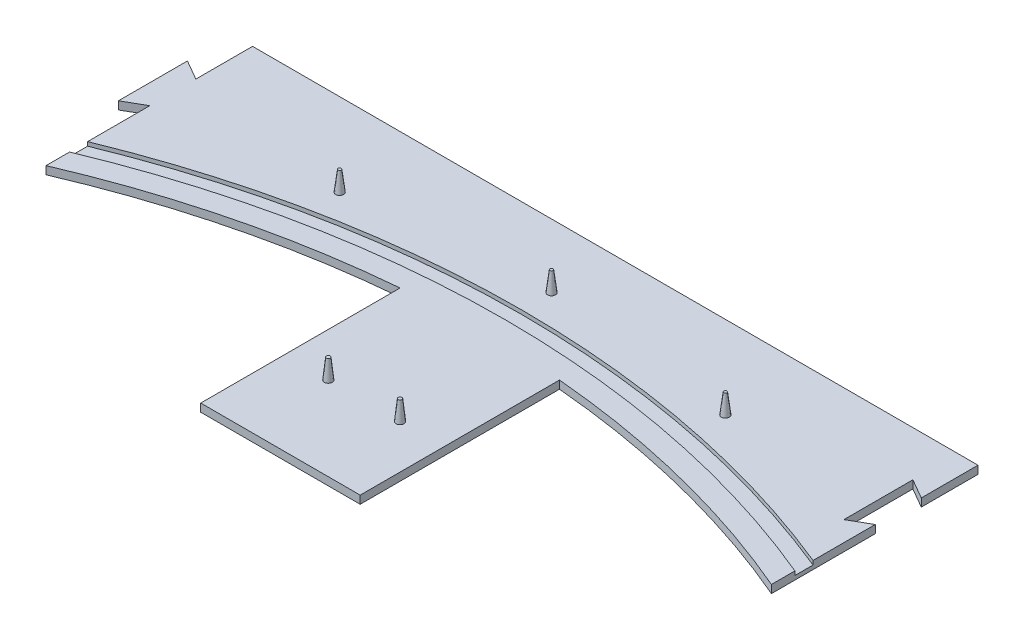
ISO-10303-21;
HEADER;
FILE_DESCRIPTION(('STEP AP214'),'2;1');
FILE_NAME('part.step','',(''),(''),'','','');
FILE_SCHEMA(('AUTOMOTIVE_DESIGN { 1 0 10303 214 1 1 1 1 }'));
ENDSEC;
DATA;
#1=APPLICATION_CONTEXT('core data for automotive mechanical design processes');
#2=APPLICATION_PROTOCOL_DEFINITION('international standard','automotive_design',2000,#1);
#3=PRODUCT_CONTEXT('',#1,'mechanical');
#4=PRODUCT('Part','Part','',(#3));
#5=PRODUCT_RELATED_PRODUCT_CATEGORY('part','',(#4));
#6=PRODUCT_DEFINITION_FORMATION('','',#4);
#7=PRODUCT_DEFINITION_CONTEXT('part definition',#1,'design');
#8=PRODUCT_DEFINITION('design','',#6,#7);
#9=PRODUCT_DEFINITION_SHAPE('','',#8);
#10=(LENGTH_UNIT() NAMED_UNIT(*) SI_UNIT(.MILLI.,.METRE.));
#11=(NAMED_UNIT(*) PLANE_ANGLE_UNIT() SI_UNIT($,.RADIAN.));
#12=(NAMED_UNIT(*) SI_UNIT($,.STERADIAN.) SOLID_ANGLE_UNIT());
#13=UNCERTAINTY_MEASURE_WITH_UNIT(LENGTH_MEASURE(1.E-05),#10,'distance_accuracy_value','');
#14=(GEOMETRIC_REPRESENTATION_CONTEXT(3) GLOBAL_UNCERTAINTY_ASSIGNED_CONTEXT((#13)) GLOBAL_UNIT_ASSIGNED_CONTEXT((#10,
#11,#12)) REPRESENTATION_CONTEXT('',''));
#15=CARTESIAN_POINT('',(0.,0.,0.));
#16=DIRECTION('',(0.,0.,1.));
#17=DIRECTION('',(1.,0.,0.));
#18=AXIS2_PLACEMENT_3D('',#15,#16,#17);
#19=CARTESIAN_POINT('',(0.,0.,0.));
#20=DIRECTION('',(0.,1.,0.));
#21=DIRECTION('',(0.,0.,1.));
#22=AXIS2_PLACEMENT_3D('',#19,#20,#21);
#23=PLANE('',#22);
#24=CARTESIAN_POINT('',(-9.,0.,-201.));
#25=DIRECTION('',(0.,1.,0.));
#26=DIRECTION('',(0.,0.,1.));
#27=AXIS2_PLACEMENT_3D('',#24,#25,#26);
#28=CIRCLE('',#27,1.);
#29=CARTESIAN_POINT('',(-9.,0.,-200.));
#30=VERTEX_POINT('',#29);
#31=EDGE_CURVE('E334',#30,#30,#28,.T.);
#32=ORIENTED_EDGE('',*,*,#31,.F.);
#33=EDGE_LOOP('',(#32));
#34=FACE_BOUND('',#33,.T.);
#35=CARTESIAN_POINT('',(9.,0.,-201.));
#36=DIRECTION('',(0.,1.,0.));
#37=DIRECTION('',(0.,0.,1.));
#38=AXIS2_PLACEMENT_3D('',#35,#36,#37);
#39=CIRCLE('',#38,1.);
#40=CARTESIAN_POINT('',(9.,0.,-200.));
#41=VERTEX_POINT('',#40);
#42=EDGE_CURVE('E344',#41,#41,#39,.T.);
#43=ORIENTED_EDGE('',*,*,#42,.F.);
#44=EDGE_LOOP('',(#43));
#45=FACE_BOUND('',#44,.T.);
#46=DIRECTION('',(0.,0.,-1.));
#47=VECTOR('',#46,1.);
#48=CARTESIAN_POINT('',(90.9999999999999,0.,0.));
#49=LINE('',#48,#47);
#50=CARTESIAN_POINT('',(91.,0.,-212.176813059297));
#51=VERTEX_POINT('',#50);
#52=CARTESIAN_POINT('',(91.,0.,-218.074964175166));
#53=VERTEX_POINT('',#52);
#54=EDGE_CURVE('E280',#51,#53,#49,.T.);
#55=ORIENTED_EDGE('',*,*,#54,.T.);
#56=CARTESIAN_POINT('',(0.,0.,0.));
#57=DIRECTION('',(0.,1.,0.));
#58=DIRECTION('',(0.,0.,1.));
#59=AXIS2_PLACEMENT_3D('',#56,#57,#58);
#60=CIRCLE('',#59,236.3);
#61=CARTESIAN_POINT('',(-91.,0.,-218.074964175166));
#62=VERTEX_POINT('',#61);
#63=EDGE_CURVE('E176',#53,#62,#60,.T.);
#64=ORIENTED_EDGE('',*,*,#63,.T.);
#65=DIRECTION('',(0.,0.,1.));
#66=VECTOR('',#65,1.);
#67=CARTESIAN_POINT('',(-91.0000000000001,0.,0.));
#68=LINE('',#67,#66);
#69=CARTESIAN_POINT('',(-91.,0.,-212.176813059297));
#70=VERTEX_POINT('',#69);
#71=EDGE_CURVE('E269',#62,#70,#68,.T.);
#72=ORIENTED_EDGE('',*,*,#71,.T.);
#73=CARTESIAN_POINT('',(0.,0.,0.));
#74=DIRECTION('',(0.,1.,0.));
#75=DIRECTION('',(0.,0.,-1.));
#76=AXIS2_PLACEMENT_3D('',#73,#74,#75);
#77=CIRCLE('',#76,230.867927612304);
#78=CARTESIAN_POINT('',(-20.,0.,-230.));
#79=VERTEX_POINT('',#78);
#80=EDGE_CURVE('E293',#79,#70,#77,.T.);
#81=ORIENTED_EDGE('',*,*,#80,.F.);
#82=DIRECTION('',(0.,0.,1.));
#83=VECTOR('',#82,1.);
#84=CARTESIAN_POINT('',(-20.,0.,0.));
#85=LINE('',#84,#83);
#86=CARTESIAN_POINT('',(-20.,0.,-180.));
#87=VERTEX_POINT('',#86);
#88=EDGE_CURVE('E311',#79,#87,#85,.T.);
#89=ORIENTED_EDGE('',*,*,#88,.T.);
#90=DIRECTION('',(1.,0.,0.));
#91=VECTOR('',#90,1.);
#92=CARTESIAN_POINT('',(0.,0.,-180.));
#93=LINE('',#92,#91);
#94=CARTESIAN_POINT('',(20.,0.,-180.));
#95=VERTEX_POINT('',#94);
#96=EDGE_CURVE('E307',#87,#95,#93,.T.);
#97=ORIENTED_EDGE('',*,*,#96,.T.);
#98=DIRECTION('',(0.,0.,1.));
#99=VECTOR('',#98,1.);
#100=CARTESIAN_POINT('',(20.,0.,0.));
#101=LINE('',#100,#99);
#102=CARTESIAN_POINT('',(20.,0.,-230.));
#103=VERTEX_POINT('',#102);
#104=EDGE_CURVE('E288',#103,#95,#101,.T.);
#105=ORIENTED_EDGE('',*,*,#104,.F.);
#106=CARTESIAN_POINT('',(0.,0.,0.));
#107=DIRECTION('',(0.,1.,0.));
#108=DIRECTION('',(0.866025403784436,0.,-0.500000000000004));
#109=AXIS2_PLACEMENT_3D('',#106,#107,#108);
#110=CIRCLE('',#109,230.867927612304);
#111=EDGE_CURVE('E321',#51,#103,#110,.T.);
#112=ORIENTED_EDGE('',*,*,#111,.F.);
#113=EDGE_LOOP('',(#55,#64,#72,#81,#89,#97,#105,#112));
#114=FACE_BOUND('',#113,.T.);
#115=ADVANCED_FACE('F38',(#34,#45,#114),#23,.T.);
#116=CARTESIAN_POINT('',(91.,5.,-290.));
#117=DIRECTION('',(1.,0.,0.));
#118=DIRECTION('',(0.,0.,-1.));
#119=AXIS2_PLACEMENT_3D('',#116,#117,#118);
#120=PLANE('',#119);
#121=DIRECTION('',(0.,1.,0.));
#122=VECTOR('',#121,1.);
#123=CARTESIAN_POINT('',(90.9999999999999,-1.,-222.619069264068));
#124=LINE('',#123,#122);
#125=CARTESIAN_POINT('',(91.,-1.,-222.619069264068));
#126=VERTEX_POINT('',#125);
#127=CARTESIAN_POINT('',(91.,0.,-222.619069264068));
#128=VERTEX_POINT('',#127);
#129=EDGE_CURVE('E196',#126,#128,#124,.T.);
#130=ORIENTED_EDGE('',*,*,#129,.F.);
#131=DIRECTION('',(0.,0.,1.));
#132=VECTOR('',#131,1.);
#133=CARTESIAN_POINT('',(91.,-1.,-290.));
#134=LINE('',#133,#132);
#135=CARTESIAN_POINT('',(91.,-1.,-218.074964175166));
#136=VERTEX_POINT('',#135);
#137=EDGE_CURVE('E181',#126,#136,#134,.T.);
#138=ORIENTED_EDGE('',*,*,#137,.T.);
#139=DIRECTION('',(0.,1.,0.));
#140=VECTOR('',#139,1.);
#141=CARTESIAN_POINT('',(90.9999999999999,-1.,-218.074964175166));
#142=LINE('',#141,#140);
#143=EDGE_CURVE('E173',#136,#53,#142,.T.);
#144=ORIENTED_EDGE('',*,*,#143,.T.);
#145=ORIENTED_EDGE('',*,*,#54,.F.);
#146=DIRECTION('',(0.,1.,0.));
#147=VECTOR('',#146,1.);
#148=CARTESIAN_POINT('',(90.9999999999999,-2.,-212.176813059297));
#149=LINE('',#148,#147);
#150=CARTESIAN_POINT('',(91.,-2.,-212.176813059297));
#151=VERTEX_POINT('',#150);
#152=EDGE_CURVE('E388',#51,#151,#149,.F.);
#153=ORIENTED_EDGE('',*,*,#152,.T.);
#154=DIRECTION('',(0.,0.,1.));
#155=VECTOR('',#154,1.);
#156=CARTESIAN_POINT('',(91.,-2.,-290.));
#157=LINE('',#156,#155);
#158=CARTESIAN_POINT('',(91.,-2.,-238.226497308104));
#159=VERTEX_POINT('',#158);
#160=EDGE_CURVE('E259',#159,#151,#157,.T.);
#161=ORIENTED_EDGE('',*,*,#160,.F.);
#162=DIRECTION('',(0.,-1.,0.));
#163=VECTOR('',#162,1.);
#164=CARTESIAN_POINT('',(91.,5.,-238.226497308104));
#165=LINE('',#164,#163);
#166=CARTESIAN_POINT('',(91.,0.,-238.226497308104));
#167=VERTEX_POINT('',#166);
#168=EDGE_CURVE('E402',#167,#159,#165,.T.);
#169=ORIENTED_EDGE('',*,*,#168,.F.);
#170=EDGE_CURVE('E284',#128,#167,#49,.T.);
#171=ORIENTED_EDGE('',*,*,#170,.F.);
#172=EDGE_LOOP('',(#130,#138,#144,#145,#153,#161,#169,#171));
#173=FACE_BOUND('',#172,.T.);
#174=ADVANCED_FACE('F194',(#173),#120,.T.);
#175=CARTESIAN_POINT('',(-91.,5.,-290.));
#176=DIRECTION('',(-1.,0.,0.));
#177=DIRECTION('',(0.,0.,1.));
#178=AXIS2_PLACEMENT_3D('',#175,#176,#177);
#179=PLANE('',#178);
#180=DIRECTION('',(0.,-1.,0.));
#181=VECTOR('',#180,1.);
#182=CARTESIAN_POINT('',(-91.,5.,-249.773502691896));
#183=LINE('',#182,#181);
#184=CARTESIAN_POINT('',(-91.,0.,-249.773502691896));
#185=VERTEX_POINT('',#184);
#186=CARTESIAN_POINT('',(-91.,-2.,-249.773502691896));
#187=VERTEX_POINT('',#186);
#188=EDGE_CURVE('E395',#185,#187,#183,.T.);
#189=ORIENTED_EDGE('',*,*,#188,.F.);
#190=CARTESIAN_POINT('',(-91.,0.,-264.));
#191=VERTEX_POINT('',#190);
#192=EDGE_CURVE('E270',#191,#185,#68,.T.);
#193=ORIENTED_EDGE('',*,*,#192,.F.);
#194=DIRECTION('',(0.,1.,0.));
#195=VECTOR('',#194,1.);
#196=CARTESIAN_POINT('',(-91.,-2.,-264.));
#197=LINE('',#196,#195);
#198=CARTESIAN_POINT('',(-91.,-2.,-264.));
#199=VERTEX_POINT('',#198);
#200=EDGE_CURVE('E274',#199,#191,#197,.T.);
#201=ORIENTED_EDGE('',*,*,#200,.F.);
#202=DIRECTION('',(0.,0.,-1.));
#203=VECTOR('',#202,1.);
#204=CARTESIAN_POINT('',(-91.,-2.,-290.));
#205=LINE('',#204,#203);
#206=EDGE_CURVE('E264',#187,#199,#205,.T.);
#207=ORIENTED_EDGE('',*,*,#206,.F.);
#208=EDGE_LOOP('',(#189,#193,#201,#207));
#209=FACE_BOUND('',#208,.T.);
#210=ADVANCED_FACE('F447',(#209),#179,.T.);
#211=CARTESIAN_POINT('',(0.,-2.,0.));
#212=DIRECTION('',(0.,1.,0.));
#213=DIRECTION('',(0.,0.,1.));
#214=AXIS2_PLACEMENT_3D('',#211,#212,#213);
#215=PLANE('',#214);
#216=DIRECTION('',(0.,0.,1.));
#217=VECTOR('',#216,1.);
#218=CARTESIAN_POINT('',(86.,-2.,-252.660254037844));
#219=LINE('',#218,#217);
#220=CARTESIAN_POINT('',(86.,-2.,-252.660254037844));
#221=VERTEX_POINT('',#220);
#222=CARTESIAN_POINT('',(86.,-2.,-235.339745962156));
#223=VERTEX_POINT('',#222);
#224=EDGE_CURVE('E212',#221,#223,#219,.T.);
#225=ORIENTED_EDGE('',*,*,#224,.T.);
#226=DIRECTION('',(0.866025403784438,0.,-0.5));
#227=VECTOR('',#226,1.);
#228=CARTESIAN_POINT('',(86.,-2.,-235.339745962156));
#229=LINE('',#228,#227);
#230=EDGE_CURVE('E205',#223,#159,#229,.T.);
#231=ORIENTED_EDGE('',*,*,#230,.T.);
#232=ORIENTED_EDGE('',*,*,#160,.T.);
#233=CARTESIAN_POINT('',(0.,-2.,0.));
#234=DIRECTION('',(0.,1.,0.));
#235=DIRECTION('',(0.866025403784436,0.,-0.500000000000004));
#236=AXIS2_PLACEMENT_3D('',#233,#234,#235);
#237=CIRCLE('',#236,230.867927612304);
#238=CARTESIAN_POINT('',(20.,-2.,-230.));
#239=VERTEX_POINT('',#238);
#240=EDGE_CURVE('E331',#151,#239,#237,.T.);
#241=ORIENTED_EDGE('',*,*,#240,.T.);
#242=DIRECTION('',(0.,0.,1.));
#243=VECTOR('',#242,1.);
#244=CARTESIAN_POINT('',(20.,-2.,0.));
#245=LINE('',#244,#243);
#246=CARTESIAN_POINT('',(20.,-2.,-180.));
#247=VERTEX_POINT('',#246);
#248=EDGE_CURVE('E289',#239,#247,#245,.T.);
#249=ORIENTED_EDGE('',*,*,#248,.T.);
#250=DIRECTION('',(1.,0.,0.));
#251=VECTOR('',#250,1.);
#252=CARTESIAN_POINT('',(0.,-2.,-180.));
#253=LINE('',#252,#251);
#254=CARTESIAN_POINT('',(-20.,-2.,-180.));
#255=VERTEX_POINT('',#254);
#256=EDGE_CURVE('E292',#255,#247,#253,.T.);
#257=ORIENTED_EDGE('',*,*,#256,.F.);
#258=DIRECTION('',(0.,0.,1.));
#259=VECTOR('',#258,1.);
#260=CARTESIAN_POINT('',(-20.,-2.,0.));
#261=LINE('',#260,#259);
#262=CARTESIAN_POINT('',(-20.,-2.,-230.));
#263=VERTEX_POINT('',#262);
#264=EDGE_CURVE('E296',#263,#255,#261,.T.);
#265=ORIENTED_EDGE('',*,*,#264,.F.);
#266=CARTESIAN_POINT('',(0.,-2.,0.));
#267=DIRECTION('',(0.,1.,0.));
#268=DIRECTION('',(0.,0.,-1.));
#269=AXIS2_PLACEMENT_3D('',#266,#267,#268);
#270=CIRCLE('',#269,230.867927612304);
#271=CARTESIAN_POINT('',(-91.,-2.,-212.176813059297));
#272=VERTEX_POINT('',#271);
#273=EDGE_CURVE('E299',#263,#272,#270,.T.);
#274=ORIENTED_EDGE('',*,*,#273,.T.);
#275=CARTESIAN_POINT('',(-91.,-2.,-238.226497308104));
#276=VERTEX_POINT('',#275);
#277=EDGE_CURVE('E265',#272,#276,#205,.T.);
#278=ORIENTED_EDGE('',*,*,#277,.T.);
#279=DIRECTION('',(-0.866025403784439,0.,0.5));
#280=VECTOR('',#279,1.);
#281=CARTESIAN_POINT('',(-96.,-2.,-235.339745962156));
#282=LINE('',#281,#280);
#283=CARTESIAN_POINT('',(-96.,-2.,-235.339745962156));
#284=VERTEX_POINT('',#283);
#285=EDGE_CURVE('E233',#276,#284,#282,.T.);
#286=ORIENTED_EDGE('',*,*,#285,.T.);
#287=DIRECTION('',(0.,0.,-1.));
#288=VECTOR('',#287,1.);
#289=CARTESIAN_POINT('',(-96.,-2.,-252.660254037844));
#290=LINE('',#289,#288);
#291=CARTESIAN_POINT('',(-96.,-2.,-252.660254037844));
#292=VERTEX_POINT('',#291);
#293=EDGE_CURVE('E240',#284,#292,#290,.T.);
#294=ORIENTED_EDGE('',*,*,#293,.T.);
#295=DIRECTION('',(0.866025403784439,0.,0.499999999999999));
#296=VECTOR('',#295,1.);
#297=CARTESIAN_POINT('',(-81.,-2.,-244.));
#298=LINE('',#297,#296);
#299=EDGE_CURVE('E236',#292,#187,#298,.T.);
#300=ORIENTED_EDGE('',*,*,#299,.T.);
#301=ORIENTED_EDGE('',*,*,#206,.T.);
#302=DIRECTION('',(-1.,0.,0.));
#303=VECTOR('',#302,1.);
#304=CARTESIAN_POINT('',(131.979594929244,-2.,-264.));
#305=LINE('',#304,#303);
#306=CARTESIAN_POINT('',(91.,-2.,-264.));
#307=VERTEX_POINT('',#306);
#308=EDGE_CURVE('E377',#307,#199,#305,.T.);
#309=ORIENTED_EDGE('',*,*,#308,.F.);
#310=CARTESIAN_POINT('',(91.,-2.,-249.773502691896));
#311=VERTEX_POINT('',#310);
#312=EDGE_CURVE('E260',#307,#311,#157,.T.);
#313=ORIENTED_EDGE('',*,*,#312,.T.);
#314=DIRECTION('',(-0.866025403784438,0.,-0.5));
#315=VECTOR('',#314,1.);
#316=CARTESIAN_POINT('',(101.,-2.,-244.));
#317=LINE('',#316,#315);
#318=EDGE_CURVE('E62',#311,#221,#317,.T.);
#319=ORIENTED_EDGE('',*,*,#318,.T.);
#320=EDGE_LOOP('',(#225,#231,#232,#241,#249,#257,#265,#274,#278,#286,#294,#300,#301,#309,#313,#319));
#321=FACE_BOUND('',#320,.T.);
#322=ADVANCED_FACE('F464',(#321),#215,.F.);
#323=CARTESIAN_POINT('',(0.,0.,0.));
#324=DIRECTION('',(0.,1.,0.));
#325=DIRECTION('',(0.,0.,1.));
#326=AXIS2_PLACEMENT_3D('',#323,#324,#325);
#327=CIRCLE('',#326,240.5);
#328=CARTESIAN_POINT('',(-91.,0.,-222.619069264068));
#329=VERTEX_POINT('',#328);
#330=EDGE_CURVE('E191',#128,#329,#327,.T.);
#331=ORIENTED_EDGE('',*,*,#330,.F.);
#332=ORIENTED_EDGE('',*,*,#170,.T.);
#333=DIRECTION('',(0.866025403784438,0.,-0.5));
#334=VECTOR('',#333,1.);
#335=CARTESIAN_POINT('',(86.,0.,-235.339745962156));
#336=LINE('',#335,#334);
#337=CARTESIAN_POINT('',(86.,0.,-235.339745962156));
#338=VERTEX_POINT('',#337);
#339=EDGE_CURVE('E201',#338,#167,#336,.T.);
#340=ORIENTED_EDGE('',*,*,#339,.F.);
#341=DIRECTION('',(0.,0.,1.));
#342=VECTOR('',#341,1.);
#343=CARTESIAN_POINT('',(86.,0.,-252.660254037844));
#344=LINE('',#343,#342);
#345=CARTESIAN_POINT('',(86.,0.,-252.660254037844));
#346=VERTEX_POINT('',#345);
#347=EDGE_CURVE('E209',#346,#338,#344,.T.);
#348=ORIENTED_EDGE('',*,*,#347,.F.);
#349=DIRECTION('',(-0.866025403784438,0.,-0.5));
#350=VECTOR('',#349,1.);
#351=CARTESIAN_POINT('',(101.,0.,-244.));
#352=LINE('',#351,#350);
#353=CARTESIAN_POINT('',(91.,0.,-249.773502691896));
#354=VERTEX_POINT('',#353);
#355=EDGE_CURVE('E220',#354,#346,#352,.T.);
#356=ORIENTED_EDGE('',*,*,#355,.F.);
#357=CARTESIAN_POINT('',(91.,0.,-264.));
#358=VERTEX_POINT('',#357);
#359=EDGE_CURVE('E279',#354,#358,#49,.T.);
#360=ORIENTED_EDGE('',*,*,#359,.T.);
#361=DIRECTION('',(-1.,0.,0.));
#362=VECTOR('',#361,1.);
#363=CARTESIAN_POINT('',(0.,0.,-264.));
#364=LINE('',#363,#362);
#365=EDGE_CURVE('E376',#358,#191,#364,.T.);
#366=ORIENTED_EDGE('',*,*,#365,.T.);
#367=ORIENTED_EDGE('',*,*,#192,.T.);
#368=DIRECTION('',(-0.866025403784439,0.,-0.499999999999999));
#369=VECTOR('',#368,1.);
#370=CARTESIAN_POINT('',(-81.,0.,-244.));
#371=LINE('',#370,#369);
#372=CARTESIAN_POINT('',(-96.,0.,-252.660254037844));
#373=VERTEX_POINT('',#372);
#374=EDGE_CURVE('E229',#185,#373,#371,.T.);
#375=ORIENTED_EDGE('',*,*,#374,.T.);
#376=DIRECTION('',(0.,0.,1.));
#377=VECTOR('',#376,1.);
#378=CARTESIAN_POINT('',(-96.,0.,-252.660254037844));
#379=LINE('',#378,#377);
#380=CARTESIAN_POINT('',(-96.,0.,-235.339745962156));
#381=VERTEX_POINT('',#380);
#382=EDGE_CURVE('E243',#373,#381,#379,.T.);
#383=ORIENTED_EDGE('',*,*,#382,.T.);
#384=DIRECTION('',(0.866025403784439,0.,-0.5));
#385=VECTOR('',#384,1.);
#386=CARTESIAN_POINT('',(-96.,0.,-235.339745962156));
#387=LINE('',#386,#385);
#388=CARTESIAN_POINT('',(-91.,0.,-238.226497308104));
#389=VERTEX_POINT('',#388);
#390=EDGE_CURVE('E247',#381,#389,#387,.T.);
#391=ORIENTED_EDGE('',*,*,#390,.T.);
#392=EDGE_CURVE('E275',#389,#329,#68,.T.);
#393=ORIENTED_EDGE('',*,*,#392,.T.);
#394=EDGE_LOOP('',(#331,#332,#340,#348,#356,#360,#366,#367,#375,#383,#391,#393));
#395=FACE_BOUND('',#394,.T.);
#396=CARTESIAN_POINT('',(0.,0.,-248.));
#397=DIRECTION('',(0.,1.,0.));
#398=DIRECTION('',(0.,0.,1.));
#399=AXIS2_PLACEMENT_3D('',#396,#397,#398);
#400=CIRCLE('',#399,1.);
#401=CARTESIAN_POINT('',(0.,0.,-247.));
#402=VERTEX_POINT('',#401);
#403=EDGE_CURVE('E368',#402,#402,#400,.T.);
#404=ORIENTED_EDGE('',*,*,#403,.F.);
#405=EDGE_LOOP('',(#404));
#406=FACE_BOUND('',#405,.T.);
#407=CARTESIAN_POINT('',(48.3823998599999,0.,-243.234749540001));
#408=DIRECTION('',(0.,1.,0.));
#409=DIRECTION('',(-0.195090322016129,0.,0.980785280403231));
#410=AXIS2_PLACEMENT_3D('',#407,#408,#409);
#411=CIRCLE('',#410,1.);
#412=CARTESIAN_POINT('',(48.1873095379837,0.,-242.253964259598));
#413=VERTEX_POINT('',#412);
#414=EDGE_CURVE('E360',#413,#413,#411,.T.);
#415=ORIENTED_EDGE('',*,*,#414,.F.);
#416=EDGE_LOOP('',(#415));
#417=FACE_BOUND('',#416,.T.);
#418=CARTESIAN_POINT('',(-48.3823998599966,0.,-243.234749540002));
#419=DIRECTION('',(0.,1.,0.));
#420=DIRECTION('',(0.195090322016115,0.,0.980785280403233));
#421=AXIS2_PLACEMENT_3D('',#418,#419,#420);
#422=CIRCLE('',#421,1.);
#423=CARTESIAN_POINT('',(-48.1873095379804,0.,-242.253964259599));
#424=VERTEX_POINT('',#423);
#425=EDGE_CURVE('E352',#424,#424,#422,.T.);
#426=ORIENTED_EDGE('',*,*,#425,.F.);
#427=EDGE_LOOP('',(#426));
#428=FACE_BOUND('',#427,.T.);
#429=ADVANCED_FACE('F427',(#395,#406,#417,#428),#23,.T.);
#430=CARTESIAN_POINT('',(0.,-2.,-264.));
#431=DIRECTION('',(0.,0.,-1.));
#432=DIRECTION('',(-1.,0.,0.));
#433=AXIS2_PLACEMENT_3D('',#430,#431,#432);
#434=PLANE('',#433);
#435=ORIENTED_EDGE('',*,*,#365,.F.);
#436=DIRECTION('',(0.,-1.,0.));
#437=VECTOR('',#436,1.);
#438=CARTESIAN_POINT('',(91.,-2.,-264.));
#439=LINE('',#438,#437);
#440=EDGE_CURVE('E283',#358,#307,#439,.T.);
#441=ORIENTED_EDGE('',*,*,#440,.T.);
#442=ORIENTED_EDGE('',*,*,#308,.T.);
#443=ORIENTED_EDGE('',*,*,#200,.T.);
#444=EDGE_LOOP('',(#435,#441,#442,#443));
#445=FACE_BOUND('',#444,.T.);
#446=ADVANCED_FACE('F40',(#445),#434,.T.);
#447=CARTESIAN_POINT('',(0.,-2.,0.));
#448=DIRECTION('',(0.,1.,0.));
#449=DIRECTION('',(0.,0.,1.));
#450=AXIS2_PLACEMENT_3D('',#447,#448,#449);
#451=CYLINDRICAL_SURFACE('',#450,230.867927612304);
#452=ORIENTED_EDGE('',*,*,#152,.F.);
#453=ORIENTED_EDGE('',*,*,#111,.T.);
#454=DIRECTION('',(0.,1.,0.));
#455=VECTOR('',#454,1.);
#456=CARTESIAN_POINT('',(20.,-2.,-230.));
#457=LINE('',#456,#455);
#458=EDGE_CURVE('E303',#239,#103,#457,.T.);
#459=ORIENTED_EDGE('',*,*,#458,.F.);
#460=ORIENTED_EDGE('',*,*,#240,.F.);
#461=EDGE_LOOP('',(#452,#453,#459,#460));
#462=FACE_BOUND('',#461,.T.);
#463=ADVANCED_FACE('F486',(#462),#451,.F.);
#464=CARTESIAN_POINT('',(0.,-2.,0.));
#465=DIRECTION('',(0.,1.,0.));
#466=DIRECTION('',(0.,0.,1.));
#467=AXIS2_PLACEMENT_3D('',#464,#465,#466);
#468=CYLINDRICAL_SURFACE('',#467,230.867927612304);
#469=DIRECTION('',(0.,1.,0.));
#470=VECTOR('',#469,1.);
#471=CARTESIAN_POINT('',(-91.,-2.,-212.176813059297));
#472=LINE('',#471,#470);
#473=EDGE_CURVE('E381',#272,#70,#472,.T.);
#474=ORIENTED_EDGE('',*,*,#473,.F.);
#475=ORIENTED_EDGE('',*,*,#273,.F.);
#476=DIRECTION('',(0.,1.,0.));
#477=VECTOR('',#476,1.);
#478=CARTESIAN_POINT('',(-20.,-2.,-230.));
#479=LINE('',#478,#477);
#480=EDGE_CURVE('E318',#263,#79,#479,.T.);
#481=ORIENTED_EDGE('',*,*,#480,.T.);
#482=ORIENTED_EDGE('',*,*,#80,.T.);
#483=EDGE_LOOP('',(#474,#475,#481,#482));
#484=FACE_BOUND('',#483,.T.);
#485=ADVANCED_FACE('F469',(#484),#468,.F.);
#486=CARTESIAN_POINT('',(0.,0.,-248.));
#487=DIRECTION('',(0.,-1.,0.));
#488=DIRECTION('',(0.,0.,1.));
#489=AXIS2_PLACEMENT_3D('',#486,#487,#488);
#490=CONICAL_SURFACE('',#489,1.,0.122173047639603);
#491=CARTESIAN_POINT('',(0.,5.,-248.));
#492=DIRECTION('',(0.,1.,0.));
#493=DIRECTION('',(0.,0.,1.));
#494=AXIS2_PLACEMENT_3D('',#491,#492,#493);
#495=CIRCLE('',#494,0.386077195485477);
#496=CARTESIAN_POINT('',(0.,5.,-247.613922804515));
#497=VERTEX_POINT('',#496);
#498=EDGE_CURVE('E372',#497,#497,#495,.T.);
#499=ORIENTED_EDGE('',*,*,#498,.F.);
#500=EDGE_LOOP('',(#499));
#501=FACE_BOUND('',#500,.T.);
#502=ORIENTED_EDGE('',*,*,#403,.T.);
#503=EDGE_LOOP('',(#502));
#504=FACE_BOUND('',#503,.T.);
#505=ADVANCED_FACE('F524',(#501,#504),#490,.T.);
#506=CARTESIAN_POINT('',(0.,5.,-248.));
#507=DIRECTION('',(0.,1.,0.));
#508=DIRECTION('',(0.,0.,1.));
#509=AXIS2_PLACEMENT_3D('',#506,#507,#508);
#510=PLANE('',#509);
#511=ORIENTED_EDGE('',*,*,#498,.T.);
#512=EDGE_LOOP('',(#511));
#513=FACE_BOUND('',#512,.T.);
#514=ADVANCED_FACE('F527',(#513),#510,.T.);
#515=CARTESIAN_POINT('',(48.3823998599999,0.,-243.234749540001));
#516=DIRECTION('',(0.,-1.,0.));
#517=DIRECTION('',(-0.195090322016129,0.,0.980785280403231));
#518=AXIS2_PLACEMENT_3D('',#515,#516,#517);
#519=CONICAL_SURFACE('',#518,1.,0.122173047639603);
#520=CARTESIAN_POINT('',(48.3823998599999,5.,-243.234749540001));
#521=DIRECTION('',(0.,1.,0.));
#522=DIRECTION('',(0.,0.,1.));
#523=AXIS2_PLACEMENT_3D('',#520,#521,#522);
#524=CIRCLE('',#523,0.386077195485477);
#525=CARTESIAN_POINT('',(48.3823998599999,5.,-242.848672344516));
#526=VERTEX_POINT('',#525);
#527=EDGE_CURVE('E364',#526,#526,#524,.T.);
#528=ORIENTED_EDGE('',*,*,#527,.F.);
#529=EDGE_LOOP('',(#528));
#530=FACE_BOUND('',#529,.T.);
#531=ORIENTED_EDGE('',*,*,#414,.T.);
#532=EDGE_LOOP('',(#531));
#533=FACE_BOUND('',#532,.T.);
#534=ADVANCED_FACE('F531',(#530,#533),#519,.T.);
#535=CARTESIAN_POINT('',(48.3823998599999,5.,-243.234749540001));
#536=DIRECTION('',(0.,1.,0.));
#537=DIRECTION('',(-0.195090322016129,0.,0.980785280403231));
#538=AXIS2_PLACEMENT_3D('',#535,#536,#537);
#539=PLANE('',#538);
#540=ORIENTED_EDGE('',*,*,#527,.T.);
#541=EDGE_LOOP('',(#540));
#542=FACE_BOUND('',#541,.T.);
#543=ADVANCED_FACE('F535',(#542),#539,.T.);
#544=CARTESIAN_POINT('',(-48.3823998599966,0.,-243.234749540002));
#545=DIRECTION('',(0.,-1.,0.));
#546=DIRECTION('',(0.195090322016115,0.,0.980785280403233));
#547=AXIS2_PLACEMENT_3D('',#544,#545,#546);
#548=CONICAL_SURFACE('',#547,1.,0.122173047639603);
#549=CARTESIAN_POINT('',(-48.3823998599966,5.,-243.234749540002));
#550=DIRECTION('',(0.,1.,0.));
#551=DIRECTION('',(0.,0.,1.));
#552=AXIS2_PLACEMENT_3D('',#549,#550,#551);
#553=CIRCLE('',#552,0.386077195485477);
#554=CARTESIAN_POINT('',(-48.3823998599966,5.,-242.848672344516));
#555=VERTEX_POINT('',#554);
#556=EDGE_CURVE('E356',#555,#555,#553,.T.);
#557=ORIENTED_EDGE('',*,*,#556,.F.);
#558=EDGE_LOOP('',(#557));
#559=FACE_BOUND('',#558,.T.);
#560=ORIENTED_EDGE('',*,*,#425,.T.);
#561=EDGE_LOOP('',(#560));
#562=FACE_BOUND('',#561,.T.);
#563=ADVANCED_FACE('F539',(#559,#562),#548,.T.);
#564=CARTESIAN_POINT('',(-48.3823998599966,5.,-243.234749540002));
#565=DIRECTION('',(0.,1.,0.));
#566=DIRECTION('',(0.195090322016115,0.,0.980785280403233));
#567=AXIS2_PLACEMENT_3D('',#564,#565,#566);
#568=PLANE('',#567);
#569=ORIENTED_EDGE('',*,*,#556,.T.);
#570=EDGE_LOOP('',(#569));
#571=FACE_BOUND('',#570,.T.);
#572=ADVANCED_FACE('F543',(#571),#568,.T.);
#573=CARTESIAN_POINT('',(9.,0.,-201.));
#574=DIRECTION('',(0.,-1.,0.));
#575=DIRECTION('',(0.,0.,1.));
#576=AXIS2_PLACEMENT_3D('',#573,#574,#575);
#577=CONICAL_SURFACE('',#576,1.,0.10471975511966);
#578=CARTESIAN_POINT('',(9.,5.,-201.));
#579=DIRECTION('',(0.,1.,0.));
#580=DIRECTION('',(0.,0.,1.));
#581=AXIS2_PLACEMENT_3D('',#578,#579,#580);
#582=CIRCLE('',#581,0.474478823671619);
#583=CARTESIAN_POINT('',(9.,5.,-200.525521176328));
#584=VERTEX_POINT('',#583);
#585=EDGE_CURVE('E348',#584,#584,#582,.T.);
#586=ORIENTED_EDGE('',*,*,#585,.F.);
#587=EDGE_LOOP('',(#586));
#588=FACE_BOUND('',#587,.T.);
#589=ORIENTED_EDGE('',*,*,#42,.T.);
#590=EDGE_LOOP('',(#589));
#591=FACE_BOUND('',#590,.T.);
#592=ADVANCED_FACE('F547',(#588,#591),#577,.T.);
#593=CARTESIAN_POINT('',(9.,5.,-201.));
#594=DIRECTION('',(0.,1.,0.));
#595=DIRECTION('',(0.,0.,1.));
#596=AXIS2_PLACEMENT_3D('',#593,#594,#595);
#597=PLANE('',#596);
#598=ORIENTED_EDGE('',*,*,#585,.T.);
#599=EDGE_LOOP('',(#598));
#600=FACE_BOUND('',#599,.T.);
#601=ADVANCED_FACE('F551',(#600),#597,.T.);
#602=CARTESIAN_POINT('',(-9.,0.,-201.));
#603=DIRECTION('',(0.,-1.,0.));
#604=DIRECTION('',(0.,0.,1.));
#605=AXIS2_PLACEMENT_3D('',#602,#603,#604);
#606=CONICAL_SURFACE('',#605,1.,0.10471975511966);
#607=CARTESIAN_POINT('',(-9.,5.,-201.));
#608=DIRECTION('',(0.,1.,0.));
#609=DIRECTION('',(0.,0.,1.));
#610=AXIS2_PLACEMENT_3D('',#607,#608,#609);
#611=CIRCLE('',#610,0.474478823671619);
#612=CARTESIAN_POINT('',(-9.,5.,-200.525521176328));
#613=VERTEX_POINT('',#612);
#614=EDGE_CURVE('E340',#613,#613,#611,.T.);
#615=ORIENTED_EDGE('',*,*,#614,.F.);
#616=EDGE_LOOP('',(#615));
#617=FACE_BOUND('',#616,.T.);
#618=ORIENTED_EDGE('',*,*,#31,.T.);
#619=EDGE_LOOP('',(#618));
#620=FACE_BOUND('',#619,.T.);
#621=ADVANCED_FACE('F555',(#617,#620),#606,.T.);
#622=CARTESIAN_POINT('',(-9.,5.,-201.));
#623=DIRECTION('',(0.,1.,0.));
#624=DIRECTION('',(0.,0.,1.));
#625=AXIS2_PLACEMENT_3D('',#622,#623,#624);
#626=PLANE('',#625);
#627=ORIENTED_EDGE('',*,*,#614,.T.);
#628=EDGE_LOOP('',(#627));
#629=FACE_BOUND('',#628,.T.);
#630=ADVANCED_FACE('F559',(#629),#626,.T.);
#631=CARTESIAN_POINT('',(-20.,-2.,0.));
#632=DIRECTION('',(-1.,0.,0.));
#633=DIRECTION('',(0.,0.,1.));
#634=AXIS2_PLACEMENT_3D('',#631,#632,#633);
#635=PLANE('',#634);
#636=ORIENTED_EDGE('',*,*,#88,.F.);
#637=ORIENTED_EDGE('',*,*,#480,.F.);
#638=ORIENTED_EDGE('',*,*,#264,.T.);
#639=DIRECTION('',(0.,1.,0.));
#640=VECTOR('',#639,1.);
#641=CARTESIAN_POINT('',(-20.,-2.,-180.));
#642=LINE('',#641,#640);
#643=EDGE_CURVE('E322',#255,#87,#642,.T.);
#644=ORIENTED_EDGE('',*,*,#643,.T.);
#645=EDGE_LOOP('',(#636,#637,#638,#644));
#646=FACE_BOUND('',#645,.T.);
#647=ADVANCED_FACE('F474',(#646),#635,.T.);
#648=CARTESIAN_POINT('',(0.,-2.,-180.));
#649=DIRECTION('',(0.,0.,1.));
#650=DIRECTION('',(1.,0.,0.));
#651=AXIS2_PLACEMENT_3D('',#648,#649,#650);
#652=PLANE('',#651);
#653=ORIENTED_EDGE('',*,*,#96,.F.);
#654=ORIENTED_EDGE('',*,*,#643,.F.);
#655=ORIENTED_EDGE('',*,*,#256,.T.);
#656=DIRECTION('',(0.,1.,0.));
#657=VECTOR('',#656,1.);
#658=CARTESIAN_POINT('',(20.,-2.,-180.));
#659=LINE('',#658,#657);
#660=EDGE_CURVE('E325',#247,#95,#659,.T.);
#661=ORIENTED_EDGE('',*,*,#660,.T.);
#662=EDGE_LOOP('',(#653,#654,#655,#661));
#663=FACE_BOUND('',#662,.T.);
#664=ADVANCED_FACE('F478',(#663),#652,.T.);
#665=CARTESIAN_POINT('',(20.,-2.,0.));
#666=DIRECTION('',(-1.,0.,0.));
#667=DIRECTION('',(0.,0.,1.));
#668=AXIS2_PLACEMENT_3D('',#665,#666,#667);
#669=PLANE('',#668);
#670=ORIENTED_EDGE('',*,*,#104,.T.);
#671=ORIENTED_EDGE('',*,*,#660,.F.);
#672=ORIENTED_EDGE('',*,*,#248,.F.);
#673=ORIENTED_EDGE('',*,*,#458,.T.);
#674=EDGE_LOOP('',(#670,#671,#672,#673));
#675=FACE_BOUND('',#674,.T.);
#676=ADVANCED_FACE('F482',(#675),#669,.F.);
#677=DIRECTION('',(0.,1.,0.));
#678=VECTOR('',#677,1.);
#679=CARTESIAN_POINT('',(-91.,-1.,-222.619069264068));
#680=LINE('',#679,#678);
#681=CARTESIAN_POINT('',(-91.,-1.,-222.619069264068));
#682=VERTEX_POINT('',#681);
#683=EDGE_CURVE('E11',#329,#682,#680,.F.);
#684=ORIENTED_EDGE('',*,*,#683,.F.);
#685=ORIENTED_EDGE('',*,*,#392,.F.);
#686=DIRECTION('',(0.,1.,0.));
#687=VECTOR('',#686,1.);
#688=CARTESIAN_POINT('',(-91.,5.,-238.226497308104));
#689=LINE('',#688,#687);
#690=EDGE_CURVE('E392',#276,#389,#689,.T.);
#691=ORIENTED_EDGE('',*,*,#690,.F.);
#692=ORIENTED_EDGE('',*,*,#277,.F.);
#693=ORIENTED_EDGE('',*,*,#473,.T.);
#694=ORIENTED_EDGE('',*,*,#71,.F.);
#695=DIRECTION('',(0.,1.,0.));
#696=VECTOR('',#695,1.);
#697=CARTESIAN_POINT('',(-91.,-1.,-218.074964175166));
#698=LINE('',#697,#696);
#699=CARTESIAN_POINT('',(-91.,-1.,-218.074964175166));
#700=VERTEX_POINT('',#699);
#701=EDGE_CURVE('E405',#62,#700,#698,.F.);
#702=ORIENTED_EDGE('',*,*,#701,.T.);
#703=DIRECTION('',(0.,0.,-1.));
#704=VECTOR('',#703,1.);
#705=CARTESIAN_POINT('',(-91.,-1.,-290.));
#706=LINE('',#705,#704);
#707=EDGE_CURVE('E47',#700,#682,#706,.T.);
#708=ORIENTED_EDGE('',*,*,#707,.T.);
#709=EDGE_LOOP('',(#684,#685,#691,#692,#693,#694,#702,#708));
#710=FACE_BOUND('',#709,.T.);
#711=ADVANCED_FACE('F410',(#710),#179,.T.);
#712=DIRECTION('',(0.,1.,0.));
#713=VECTOR('',#712,1.);
#714=CARTESIAN_POINT('',(91.,5.,-249.773502691896));
#715=LINE('',#714,#713);
#716=EDGE_CURVE('E399',#311,#354,#715,.T.);
#717=ORIENTED_EDGE('',*,*,#716,.F.);
#718=ORIENTED_EDGE('',*,*,#312,.F.);
#719=ORIENTED_EDGE('',*,*,#440,.F.);
#720=ORIENTED_EDGE('',*,*,#359,.F.);
#721=EDGE_LOOP('',(#717,#718,#719,#720));
#722=FACE_BOUND('',#721,.T.);
#723=ADVANCED_FACE('F440',(#722),#120,.T.);
#724=CARTESIAN_POINT('',(-81.,-24.9128784747791,-244.));
#725=DIRECTION('',(0.499999999999999,0.,-0.866025403784439));
#726=DIRECTION('',(-0.866025403784439,0.,-0.499999999999999));
#727=AXIS2_PLACEMENT_3D('',#724,#725,#726);
#728=PLANE('',#727);
#729=ORIENTED_EDGE('',*,*,#374,.F.);
#730=ORIENTED_EDGE('',*,*,#188,.T.);
#731=ORIENTED_EDGE('',*,*,#299,.F.);
#732=DIRECTION('',(0.,1.,0.));
#733=VECTOR('',#732,1.);
#734=CARTESIAN_POINT('',(-96.,-24.9128784747791,-252.660254037844));
#735=LINE('',#734,#733);
#736=EDGE_CURVE('E251',#292,#373,#735,.T.);
#737=ORIENTED_EDGE('',*,*,#736,.T.);
#738=EDGE_LOOP('',(#729,#730,#731,#737));
#739=FACE_BOUND('',#738,.T.);
#740=ADVANCED_FACE('F453',(#739),#728,.T.);
#741=CARTESIAN_POINT('',(-96.,-24.9128784747791,-235.339745962156));
#742=DIRECTION('',(0.5,0.,0.866025403784438));
#743=DIRECTION('',(0.866025403784439,0.,-0.5));
#744=AXIS2_PLACEMENT_3D('',#741,#742,#743);
#745=PLANE('',#744);
#746=ORIENTED_EDGE('',*,*,#285,.F.);
#747=ORIENTED_EDGE('',*,*,#690,.T.);
#748=ORIENTED_EDGE('',*,*,#390,.F.);
#749=DIRECTION('',(0.,1.,0.));
#750=VECTOR('',#749,1.);
#751=CARTESIAN_POINT('',(-96.,-24.9128784747791,-235.339745962156));
#752=LINE('',#751,#750);
#753=EDGE_CURVE('E237',#284,#381,#752,.T.);
#754=ORIENTED_EDGE('',*,*,#753,.F.);
#755=EDGE_LOOP('',(#746,#747,#748,#754));
#756=FACE_BOUND('',#755,.T.);
#757=ADVANCED_FACE('F459',(#756),#745,.T.);
#758=CARTESIAN_POINT('',(-96.,-24.9128784747791,-252.660254037844));
#759=DIRECTION('',(-1.,0.,0.));
#760=DIRECTION('',(0.,0.,1.));
#761=AXIS2_PLACEMENT_3D('',#758,#759,#760);
#762=PLANE('',#761);
#763=ORIENTED_EDGE('',*,*,#293,.F.);
#764=ORIENTED_EDGE('',*,*,#753,.T.);
#765=ORIENTED_EDGE('',*,*,#382,.F.);
#766=ORIENTED_EDGE('',*,*,#736,.F.);
#767=EDGE_LOOP('',(#763,#764,#765,#766));
#768=FACE_BOUND('',#767,.T.);
#769=ADVANCED_FACE('F456',(#768),#762,.T.);
#770=CARTESIAN_POINT('',(86.,-2.,-235.339745962156));
#771=DIRECTION('',(0.5,0.,0.866025403784438));
#772=DIRECTION('',(0.866025403784438,0.,-0.5));
#773=AXIS2_PLACEMENT_3D('',#770,#771,#772);
#774=PLANE('',#773);
#775=ORIENTED_EDGE('',*,*,#168,.T.);
#776=ORIENTED_EDGE('',*,*,#230,.F.);
#777=DIRECTION('',(0.,1.,0.));
#778=VECTOR('',#777,1.);
#779=CARTESIAN_POINT('',(86.,-2.,-235.339745962156));
#780=LINE('',#779,#778);
#781=EDGE_CURVE('E226',#223,#338,#780,.T.);
#782=ORIENTED_EDGE('',*,*,#781,.T.);
#783=ORIENTED_EDGE('',*,*,#339,.T.);
#784=EDGE_LOOP('',(#775,#776,#782,#783));
#785=FACE_BOUND('',#784,.T.);
#786=ADVANCED_FACE('F492',(#785),#774,.F.);
#787=CARTESIAN_POINT('',(86.,-2.,-252.660254037844));
#788=DIRECTION('',(-1.,0.,0.));
#789=DIRECTION('',(0.,0.,1.));
#790=AXIS2_PLACEMENT_3D('',#787,#788,#789);
#791=PLANE('',#790);
#792=ORIENTED_EDGE('',*,*,#347,.T.);
#793=ORIENTED_EDGE('',*,*,#781,.F.);
#794=ORIENTED_EDGE('',*,*,#224,.F.);
#795=DIRECTION('',(0.,1.,0.));
#796=VECTOR('',#795,1.);
#797=CARTESIAN_POINT('',(86.,-2.,-252.660254037844));
#798=LINE('',#797,#796);
#799=EDGE_CURVE('E216',#221,#346,#798,.T.);
#800=ORIENTED_EDGE('',*,*,#799,.T.);
#801=EDGE_LOOP('',(#792,#793,#794,#800));
#802=FACE_BOUND('',#801,.T.);
#803=ADVANCED_FACE('F494',(#802),#791,.F.);
#804=CARTESIAN_POINT('',(101.,-2.,-244.));
#805=DIRECTION('',(0.5,0.,-0.866025403784438));
#806=DIRECTION('',(-0.866025403784438,0.,-0.5));
#807=AXIS2_PLACEMENT_3D('',#804,#805,#806);
#808=PLANE('',#807);
#809=ORIENTED_EDGE('',*,*,#716,.T.);
#810=ORIENTED_EDGE('',*,*,#355,.T.);
#811=ORIENTED_EDGE('',*,*,#799,.F.);
#812=ORIENTED_EDGE('',*,*,#318,.F.);
#813=EDGE_LOOP('',(#809,#810,#811,#812));
#814=FACE_BOUND('',#813,.T.);
#815=ADVANCED_FACE('F495',(#814),#808,.F.);
#816=CARTESIAN_POINT('',(0.,-1.,0.));
#817=DIRECTION('',(0.,1.,0.));
#818=DIRECTION('',(0.,0.,1.));
#819=AXIS2_PLACEMENT_3D('',#816,#817,#818);
#820=CYLINDRICAL_SURFACE('',#819,240.5);
#821=ORIENTED_EDGE('',*,*,#129,.T.);
#822=ORIENTED_EDGE('',*,*,#330,.T.);
#823=ORIENTED_EDGE('',*,*,#683,.T.);
#824=CARTESIAN_POINT('',(0.,-1.,0.));
#825=DIRECTION('',(0.,1.,0.));
#826=DIRECTION('',(0.,0.,1.));
#827=AXIS2_PLACEMENT_3D('',#824,#825,#826);
#828=CIRCLE('',#827,240.5);
#829=EDGE_CURVE('E182',#126,#682,#828,.T.);
#830=ORIENTED_EDGE('',*,*,#829,.F.);
#831=EDGE_LOOP('',(#821,#822,#823,#830));
#832=FACE_BOUND('',#831,.T.);
#833=ADVANCED_FACE('F425',(#832),#820,.F.);
#834=CARTESIAN_POINT('',(0.,-1.,0.));
#835=DIRECTION('',(0.,1.,0.));
#836=DIRECTION('',(0.,0.,1.));
#837=AXIS2_PLACEMENT_3D('',#834,#835,#836);
#838=PLANE('',#837);
#839=ORIENTED_EDGE('',*,*,#829,.T.);
#840=ORIENTED_EDGE('',*,*,#707,.F.);
#841=CARTESIAN_POINT('',(0.,-1.,0.));
#842=DIRECTION('',(0.,1.,0.));
#843=DIRECTION('',(0.,0.,1.));
#844=AXIS2_PLACEMENT_3D('',#841,#842,#843);
#845=CIRCLE('',#844,236.3);
#846=EDGE_CURVE('E54',#136,#700,#845,.T.);
#847=ORIENTED_EDGE('',*,*,#846,.F.);
#848=ORIENTED_EDGE('',*,*,#137,.F.);
#849=EDGE_LOOP('',(#839,#840,#847,#848));
#850=FACE_BOUND('',#849,.T.);
#851=ADVANCED_FACE('F186',(#850),#838,.T.);
#852=CARTESIAN_POINT('',(0.,-1.,0.));
#853=DIRECTION('',(0.,1.,0.));
#854=DIRECTION('',(0.,0.,1.));
#855=AXIS2_PLACEMENT_3D('',#852,#853,#854);
#856=CYLINDRICAL_SURFACE('',#855,236.3);
#857=ORIENTED_EDGE('',*,*,#846,.T.);
#858=ORIENTED_EDGE('',*,*,#701,.F.);
#859=ORIENTED_EDGE('',*,*,#63,.F.);
#860=ORIENTED_EDGE('',*,*,#143,.F.);
#861=EDGE_LOOP('',(#857,#858,#859,#860));
#862=FACE_BOUND('',#861,.T.);
#863=ADVANCED_FACE('F174',(#862),#856,.T.);
#864=CLOSED_SHELL('',(#115,#174,#210,#322,#429,#446,#463,#485,#505,#514,#534,#543,#563,#572,
#592,#601,#621,#630,#647,#664,#676,#711,#723,#740,#757,#769,#786,#803,#815,#833,#851,#863));
#865=MANIFOLD_SOLID_BREP('B2',#864);
#866=ADVANCED_BREP_SHAPE_REPRESENTATION('',(#18,#865),#14);
#867=SHAPE_DEFINITION_REPRESENTATION(#9,#866);
ENDSEC;
END-ISO-10303-21;
